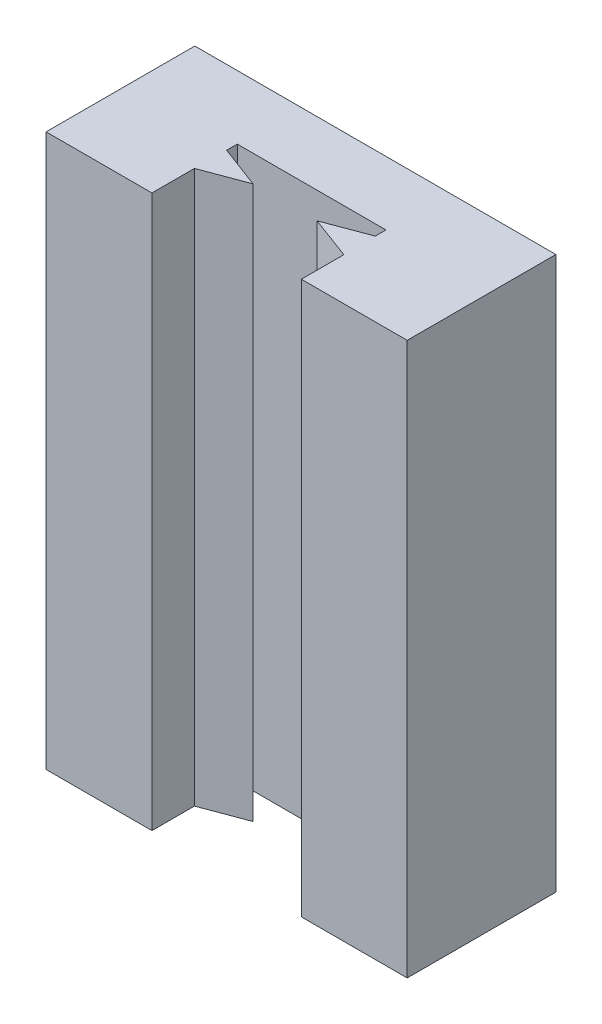
ISO-10303-21;
HEADER;
FILE_DESCRIPTION(('STEP AP214'),'2;1');
FILE_NAME('part.step','',(''),(''),'','','');
FILE_SCHEMA(('AUTOMOTIVE_DESIGN { 1 0 10303 214 1 1 1 1 }'));
ENDSEC;
DATA;
#1=APPLICATION_CONTEXT('core data for automotive mechanical design processes');
#2=APPLICATION_PROTOCOL_DEFINITION('international standard','automotive_design',2000,#1);
#3=PRODUCT_CONTEXT('',#1,'mechanical');
#4=PRODUCT('Part','Part','',(#3));
#5=PRODUCT_RELATED_PRODUCT_CATEGORY('part','',(#4));
#6=PRODUCT_DEFINITION_FORMATION('','',#4);
#7=PRODUCT_DEFINITION_CONTEXT('part definition',#1,'design');
#8=PRODUCT_DEFINITION('design','',#6,#7);
#9=PRODUCT_DEFINITION_SHAPE('','',#8);
#10=(LENGTH_UNIT() NAMED_UNIT(*) SI_UNIT(.MILLI.,.METRE.));
#11=(NAMED_UNIT(*) PLANE_ANGLE_UNIT() SI_UNIT($,.RADIAN.));
#12=(NAMED_UNIT(*) SI_UNIT($,.STERADIAN.) SOLID_ANGLE_UNIT());
#13=UNCERTAINTY_MEASURE_WITH_UNIT(LENGTH_MEASURE(1.E-05),#10,'distance_accuracy_value','');
#14=(GEOMETRIC_REPRESENTATION_CONTEXT(3) GLOBAL_UNCERTAINTY_ASSIGNED_CONTEXT((#13)) GLOBAL_UNIT_ASSIGNED_CONTEXT((#10,
#11,#12)) REPRESENTATION_CONTEXT('',''));
#15=CARTESIAN_POINT('',(0.,0.,0.));
#16=DIRECTION('',(0.,0.,1.));
#17=DIRECTION('',(1.,0.,0.));
#18=AXIS2_PLACEMENT_3D('',#15,#16,#17);
#19=CARTESIAN_POINT('',(-8.49999999999999,26.,0.));
#20=DIRECTION('',(1.,0.,0.));
#21=DIRECTION('',(0.,0.,-1.));
#22=AXIS2_PLACEMENT_3D('',#19,#20,#21);
#23=PLANE('',#22);
#24=DIRECTION('',(0.,0.,1.));
#25=VECTOR('',#24,1.);
#26=CARTESIAN_POINT('',(-8.49999999999999,0.,0.));
#27=LINE('',#26,#25);
#28=CARTESIAN_POINT('',(-8.49999999999999,0.,0.));
#29=VERTEX_POINT('',#28);
#30=CARTESIAN_POINT('',(-8.49999999999999,0.,7.));
#31=VERTEX_POINT('',#30);
#32=EDGE_CURVE('E169',#29,#31,#27,.T.);
#33=ORIENTED_EDGE('',*,*,#32,.T.);
#34=DIRECTION('',(0.,-1.,0.));
#35=VECTOR('',#34,1.);
#36=CARTESIAN_POINT('',(-8.49999999999999,26.,7.));
#37=LINE('',#36,#35);
#38=CARTESIAN_POINT('',(-8.49999999999999,26.,7.));
#39=VERTEX_POINT('',#38);
#40=EDGE_CURVE('E11',#39,#31,#37,.T.);
#41=ORIENTED_EDGE('',*,*,#40,.F.);
#42=DIRECTION('',(0.,0.,1.));
#43=VECTOR('',#42,1.);
#44=CARTESIAN_POINT('',(-8.49999999999999,26.,0.));
#45=LINE('',#44,#43);
#46=CARTESIAN_POINT('',(-8.49999999999999,26.,0.));
#47=VERTEX_POINT('',#46);
#48=EDGE_CURVE('E196',#47,#39,#45,.T.);
#49=ORIENTED_EDGE('',*,*,#48,.F.);
#50=DIRECTION('',(0.,-1.,0.));
#51=VECTOR('',#50,1.);
#52=CARTESIAN_POINT('',(-8.49999999999999,26.,0.));
#53=LINE('',#52,#51);
#54=EDGE_CURVE('E165',#47,#29,#53,.T.);
#55=ORIENTED_EDGE('',*,*,#54,.T.);
#56=EDGE_LOOP('',(#33,#41,#49,#55));
#57=FACE_BOUND('',#56,.T.);
#58=ADVANCED_FACE('F37',(#57),#23,.F.);
#59=CARTESIAN_POINT('',(-8.49999999999999,26.,7.));
#60=DIRECTION('',(0.,0.,-1.));
#61=DIRECTION('',(-1.,0.,0.));
#62=AXIS2_PLACEMENT_3D('',#59,#60,#61);
#63=PLANE('',#62);
#64=DIRECTION('',(1.,0.,0.));
#65=VECTOR('',#64,1.);
#66=CARTESIAN_POINT('',(-8.49999999999999,0.,7.));
#67=LINE('',#66,#65);
#68=CARTESIAN_POINT('',(-3.5175531470791,0.,7.));
#69=VERTEX_POINT('',#68);
#70=EDGE_CURVE('E172',#31,#69,#67,.T.);
#71=ORIENTED_EDGE('',*,*,#70,.T.);
#72=DIRECTION('',(0.,-1.,0.));
#73=VECTOR('',#72,1.);
#74=CARTESIAN_POINT('',(-3.5175531470791,26.,7.));
#75=LINE('',#74,#73);
#76=CARTESIAN_POINT('',(-3.5175531470791,26.,7.));
#77=VERTEX_POINT('',#76);
#78=EDGE_CURVE('E45',#77,#69,#75,.T.);
#79=ORIENTED_EDGE('',*,*,#78,.F.);
#80=DIRECTION('',(1.,0.,0.));
#81=VECTOR('',#80,1.);
#82=CARTESIAN_POINT('',(-8.49999999999999,26.,7.));
#83=LINE('',#82,#81);
#84=EDGE_CURVE('E114',#39,#77,#83,.T.);
#85=ORIENTED_EDGE('',*,*,#84,.F.);
#86=ORIENTED_EDGE('',*,*,#40,.T.);
#87=EDGE_LOOP('',(#71,#79,#85,#86));
#88=FACE_BOUND('',#87,.T.);
#89=ADVANCED_FACE('F287',(#88),#63,.F.);
#90=CARTESIAN_POINT('',(-3.5175531470791,26.,7.));
#91=DIRECTION('',(-1.,0.,0.));
#92=DIRECTION('',(0.,0.,1.));
#93=AXIS2_PLACEMENT_3D('',#90,#91,#92);
#94=PLANE('',#93);
#95=DIRECTION('',(0.,0.,-1.));
#96=VECTOR('',#95,1.);
#97=CARTESIAN_POINT('',(-3.5175531470791,0.,7.));
#98=LINE('',#97,#96);
#99=CARTESIAN_POINT('',(-3.5175531470791,0.,5.));
#100=VERTEX_POINT('',#99);
#101=EDGE_CURVE('E175',#69,#100,#98,.T.);
#102=ORIENTED_EDGE('',*,*,#101,.T.);
#103=DIRECTION('',(0.,-1.,0.));
#104=VECTOR('',#103,1.);
#105=CARTESIAN_POINT('',(-3.5175531470791,26.,5.));
#106=LINE('',#105,#104);
#107=CARTESIAN_POINT('',(-3.5175531470791,26.,5.));
#108=VERTEX_POINT('',#107);
#109=EDGE_CURVE('E221',#108,#100,#106,.T.);
#110=ORIENTED_EDGE('',*,*,#109,.F.);
#111=DIRECTION('',(0.,0.,-1.));
#112=VECTOR('',#111,1.);
#113=CARTESIAN_POINT('',(-3.5175531470791,26.,7.));
#114=LINE('',#113,#112);
#115=EDGE_CURVE('E229',#77,#108,#114,.T.);
#116=ORIENTED_EDGE('',*,*,#115,.F.);
#117=ORIENTED_EDGE('',*,*,#78,.T.);
#118=EDGE_LOOP('',(#102,#110,#116,#117));
#119=FACE_BOUND('',#118,.T.);
#120=ADVANCED_FACE('F227',(#119),#94,.F.);
#121=CARTESIAN_POINT('',(-3.5175531470791,26.,5.));
#122=DIRECTION('',(-0.349756467250429,0.,-0.936840655403308));
#123=DIRECTION('',(-0.936840655403308,0.,0.349756467250429));
#124=AXIS2_PLACEMENT_3D('',#121,#122,#123);
#125=PLANE('',#124);
#126=DIRECTION('',(0.936840655403308,0.,-0.349756467250429));
#127=VECTOR('',#126,1.);
#128=CARTESIAN_POINT('',(-3.5175531470791,0.,5.));
#129=LINE('',#128,#127);
#130=CARTESIAN_POINT('',(-1.50863963912847,0.,4.25));
#131=VERTEX_POINT('',#130);
#132=EDGE_CURVE('E177',#100,#131,#129,.T.);
#133=ORIENTED_EDGE('',*,*,#132,.T.);
#134=DIRECTION('',(0.,-1.,0.));
#135=VECTOR('',#134,1.);
#136=CARTESIAN_POINT('',(-1.50863963912847,26.,4.25));
#137=LINE('',#136,#135);
#138=CARTESIAN_POINT('',(-1.50863963912847,26.,4.25));
#139=VERTEX_POINT('',#138);
#140=EDGE_CURVE('E218',#139,#131,#137,.T.);
#141=ORIENTED_EDGE('',*,*,#140,.F.);
#142=DIRECTION('',(0.936840655403308,0.,-0.349756467250429));
#143=VECTOR('',#142,1.);
#144=CARTESIAN_POINT('',(-3.5175531470791,26.,5.));
#145=LINE('',#144,#143);
#146=EDGE_CURVE('E247',#108,#139,#145,.T.);
#147=ORIENTED_EDGE('',*,*,#146,.F.);
#148=ORIENTED_EDGE('',*,*,#109,.T.);
#149=EDGE_LOOP('',(#133,#141,#147,#148));
#150=FACE_BOUND('',#149,.T.);
#151=ADVANCED_FACE('F238',(#150),#125,.F.);
#152=CARTESIAN_POINT('',(-1.50863963912847,26.,4.25));
#153=DIRECTION('',(-0.352457927214223,0.,0.935827660172456));
#154=DIRECTION('',(0.935827660172456,0.,0.352457927214223));
#155=AXIS2_PLACEMENT_3D('',#152,#153,#154);
#156=PLANE('',#155);
#157=DIRECTION('',(-0.935827660172456,0.,-0.352457927214223));
#158=VECTOR('',#157,1.);
#159=CARTESIAN_POINT('',(-1.50863963912847,0.,4.25));
#160=LINE('',#159,#158);
#161=CARTESIAN_POINT('',(-3.49999999999999,0.,3.5));
#162=VERTEX_POINT('',#161);
#163=EDGE_CURVE('E179',#131,#162,#160,.T.);
#164=ORIENTED_EDGE('',*,*,#163,.T.);
#165=DIRECTION('',(0.,-1.,0.));
#166=VECTOR('',#165,1.);
#167=CARTESIAN_POINT('',(-3.49999999999999,26.,3.5));
#168=LINE('',#167,#166);
#169=CARTESIAN_POINT('',(-3.49999999999999,26.,3.5));
#170=VERTEX_POINT('',#169);
#171=EDGE_CURVE('E215',#170,#162,#168,.T.);
#172=ORIENTED_EDGE('',*,*,#171,.F.);
#173=DIRECTION('',(-0.935827660172456,0.,-0.352457927214223));
#174=VECTOR('',#173,1.);
#175=CARTESIAN_POINT('',(-1.50863963912847,26.,4.25));
#176=LINE('',#175,#174);
#177=EDGE_CURVE('E244',#139,#170,#176,.T.);
#178=ORIENTED_EDGE('',*,*,#177,.F.);
#179=ORIENTED_EDGE('',*,*,#140,.T.);
#180=EDGE_LOOP('',(#164,#172,#178,#179));
#181=FACE_BOUND('',#180,.T.);
#182=ADVANCED_FACE('F242',(#181),#156,.F.);
#183=CARTESIAN_POINT('',(-3.49999999999999,26.,3.5));
#184=DIRECTION('',(-1.,0.,0.));
#185=DIRECTION('',(0.,0.,1.));
#186=AXIS2_PLACEMENT_3D('',#183,#184,#185);
#187=PLANE('',#186);
#188=DIRECTION('',(0.,0.,-1.));
#189=VECTOR('',#188,1.);
#190=CARTESIAN_POINT('',(-3.49999999999999,0.,3.5));
#191=LINE('',#190,#189);
#192=CARTESIAN_POINT('',(-3.49999999999999,0.,3.));
#193=VERTEX_POINT('',#192);
#194=EDGE_CURVE('E181',#162,#193,#191,.T.);
#195=ORIENTED_EDGE('',*,*,#194,.T.);
#196=DIRECTION('',(0.,-1.,0.));
#197=VECTOR('',#196,1.);
#198=CARTESIAN_POINT('',(-3.49999999999999,26.,3.));
#199=LINE('',#198,#197);
#200=CARTESIAN_POINT('',(-3.49999999999999,26.,3.));
#201=VERTEX_POINT('',#200);
#202=EDGE_CURVE('E212',#201,#193,#199,.T.);
#203=ORIENTED_EDGE('',*,*,#202,.F.);
#204=DIRECTION('',(0.,0.,-1.));
#205=VECTOR('',#204,1.);
#206=CARTESIAN_POINT('',(-3.49999999999999,26.,3.5));
#207=LINE('',#206,#205);
#208=EDGE_CURVE('E246',#170,#201,#207,.T.);
#209=ORIENTED_EDGE('',*,*,#208,.F.);
#210=ORIENTED_EDGE('',*,*,#171,.T.);
#211=EDGE_LOOP('',(#195,#203,#209,#210));
#212=FACE_BOUND('',#211,.T.);
#213=ADVANCED_FACE('F300',(#212),#187,.F.);
#214=CARTESIAN_POINT('',(-3.49999999999999,26.,3.));
#215=DIRECTION('',(0.,0.,-1.));
#216=DIRECTION('',(-1.,0.,0.));
#217=AXIS2_PLACEMENT_3D('',#214,#215,#216);
#218=PLANE('',#217);
#219=DIRECTION('',(1.,0.,0.));
#220=VECTOR('',#219,1.);
#221=CARTESIAN_POINT('',(-3.49999999999999,0.,3.));
#222=LINE('',#221,#220);
#223=CARTESIAN_POINT('',(3.50000000000001,0.,3.));
#224=VERTEX_POINT('',#223);
#225=EDGE_CURVE('E183',#193,#224,#222,.T.);
#226=ORIENTED_EDGE('',*,*,#225,.T.);
#227=DIRECTION('',(0.,-1.,0.));
#228=VECTOR('',#227,1.);
#229=CARTESIAN_POINT('',(3.50000000000001,26.,3.));
#230=LINE('',#229,#228);
#231=CARTESIAN_POINT('',(3.50000000000001,26.,3.));
#232=VERTEX_POINT('',#231);
#233=EDGE_CURVE('E209',#232,#224,#230,.T.);
#234=ORIENTED_EDGE('',*,*,#233,.F.);
#235=DIRECTION('',(1.,0.,0.));
#236=VECTOR('',#235,1.);
#237=CARTESIAN_POINT('',(-3.49999999999999,26.,3.));
#238=LINE('',#237,#236);
#239=EDGE_CURVE('E249',#201,#232,#238,.T.);
#240=ORIENTED_EDGE('',*,*,#239,.F.);
#241=ORIENTED_EDGE('',*,*,#202,.T.);
#242=EDGE_LOOP('',(#226,#234,#240,#241));
#243=FACE_BOUND('',#242,.T.);
#244=ADVANCED_FACE('F303',(#243),#218,.F.);
#245=CARTESIAN_POINT('',(3.50000000000001,26.,3.5));
#246=DIRECTION('',(1.,0.,0.));
#247=DIRECTION('',(0.,0.,-1.));
#248=AXIS2_PLACEMENT_3D('',#245,#246,#247);
#249=PLANE('',#248);
#250=DIRECTION('',(0.,0.,1.));
#251=VECTOR('',#250,1.);
#252=CARTESIAN_POINT('',(3.50000000000001,0.,3.5));
#253=LINE('',#252,#251);
#254=CARTESIAN_POINT('',(3.50000000000001,0.,3.5));
#255=VERTEX_POINT('',#254);
#256=EDGE_CURVE('E185',#224,#255,#253,.T.);
#257=ORIENTED_EDGE('',*,*,#256,.T.);
#258=DIRECTION('',(0.,-1.,0.));
#259=VECTOR('',#258,1.);
#260=CARTESIAN_POINT('',(3.50000000000001,26.,3.5));
#261=LINE('',#260,#259);
#262=CARTESIAN_POINT('',(3.50000000000001,26.,3.5));
#263=VERTEX_POINT('',#262);
#264=EDGE_CURVE('E206',#263,#255,#261,.T.);
#265=ORIENTED_EDGE('',*,*,#264,.F.);
#266=DIRECTION('',(0.,0.,1.));
#267=VECTOR('',#266,1.);
#268=CARTESIAN_POINT('',(3.50000000000001,26.,3.5));
#269=LINE('',#268,#267);
#270=EDGE_CURVE('E255',#232,#263,#269,.T.);
#271=ORIENTED_EDGE('',*,*,#270,.F.);
#272=ORIENTED_EDGE('',*,*,#233,.T.);
#273=EDGE_LOOP('',(#257,#265,#271,#272));
#274=FACE_BOUND('',#273,.T.);
#275=ADVANCED_FACE('F307',(#274),#249,.F.);
#276=CARTESIAN_POINT('',(1.50863963912849,26.,4.25));
#277=DIRECTION('',(0.352457927214223,0.,0.935827660172456));
#278=DIRECTION('',(0.935827660172456,0.,-0.352457927214223));
#279=AXIS2_PLACEMENT_3D('',#276,#277,#278);
#280=PLANE('',#279);
#281=DIRECTION('',(-0.935827660172456,0.,0.352457927214223));
#282=VECTOR('',#281,1.);
#283=CARTESIAN_POINT('',(1.50863963912849,0.,4.25));
#284=LINE('',#283,#282);
#285=CARTESIAN_POINT('',(1.50863963912849,0.,4.25));
#286=VERTEX_POINT('',#285);
#287=EDGE_CURVE('E187',#255,#286,#284,.T.);
#288=ORIENTED_EDGE('',*,*,#287,.T.);
#289=DIRECTION('',(0.,-1.,0.));
#290=VECTOR('',#289,1.);
#291=CARTESIAN_POINT('',(1.50863963912849,26.,4.25));
#292=LINE('',#291,#290);
#293=CARTESIAN_POINT('',(1.50863963912849,26.,4.25));
#294=VERTEX_POINT('',#293);
#295=EDGE_CURVE('E203',#294,#286,#292,.T.);
#296=ORIENTED_EDGE('',*,*,#295,.F.);
#297=DIRECTION('',(-0.935827660172456,0.,0.352457927214223));
#298=VECTOR('',#297,1.);
#299=CARTESIAN_POINT('',(1.50863963912849,26.,4.25));
#300=LINE('',#299,#298);
#301=EDGE_CURVE('E257',#263,#294,#300,.T.);
#302=ORIENTED_EDGE('',*,*,#301,.F.);
#303=ORIENTED_EDGE('',*,*,#264,.T.);
#304=EDGE_LOOP('',(#288,#296,#302,#303));
#305=FACE_BOUND('',#304,.T.);
#306=ADVANCED_FACE('F311',(#305),#280,.F.);
#307=CARTESIAN_POINT('',(3.51755314707913,26.,5.));
#308=DIRECTION('',(0.349756467250428,0.,-0.936840655403308));
#309=DIRECTION('',(-0.936840655403308,0.,-0.349756467250428));
#310=AXIS2_PLACEMENT_3D('',#307,#308,#309);
#311=PLANE('',#310);
#312=DIRECTION('',(0.936840655403308,0.,0.349756467250428));
#313=VECTOR('',#312,1.);
#314=CARTESIAN_POINT('',(3.51755314707913,0.,5.));
#315=LINE('',#314,#313);
#316=CARTESIAN_POINT('',(3.51755314707913,0.,5.));
#317=VERTEX_POINT('',#316);
#318=EDGE_CURVE('E189',#286,#317,#315,.T.);
#319=ORIENTED_EDGE('',*,*,#318,.T.);
#320=DIRECTION('',(0.,-1.,0.));
#321=VECTOR('',#320,1.);
#322=CARTESIAN_POINT('',(3.51755314707913,26.,5.));
#323=LINE('',#322,#321);
#324=CARTESIAN_POINT('',(3.51755314707913,26.,5.));
#325=VERTEX_POINT('',#324);
#326=EDGE_CURVE('E200',#325,#317,#323,.T.);
#327=ORIENTED_EDGE('',*,*,#326,.F.);
#328=DIRECTION('',(0.936840655403308,0.,0.349756467250428));
#329=VECTOR('',#328,1.);
#330=CARTESIAN_POINT('',(3.51755314707913,26.,5.));
#331=LINE('',#330,#329);
#332=EDGE_CURVE('E259',#294,#325,#331,.T.);
#333=ORIENTED_EDGE('',*,*,#332,.F.);
#334=ORIENTED_EDGE('',*,*,#295,.T.);
#335=EDGE_LOOP('',(#319,#327,#333,#334));
#336=FACE_BOUND('',#335,.T.);
#337=ADVANCED_FACE('F265',(#336),#311,.F.);
#338=CARTESIAN_POINT('',(3.51755314707913,26.,7.));
#339=DIRECTION('',(1.,0.,0.));
#340=DIRECTION('',(0.,0.,-1.));
#341=AXIS2_PLACEMENT_3D('',#338,#339,#340);
#342=PLANE('',#341);
#343=DIRECTION('',(0.,0.,1.));
#344=VECTOR('',#343,1.);
#345=CARTESIAN_POINT('',(3.51755314707913,0.,7.));
#346=LINE('',#345,#344);
#347=CARTESIAN_POINT('',(3.51755314707913,0.,7.));
#348=VERTEX_POINT('',#347);
#349=EDGE_CURVE('E191',#317,#348,#346,.T.);
#350=ORIENTED_EDGE('',*,*,#349,.T.);
#351=DIRECTION('',(0.,-1.,0.));
#352=VECTOR('',#351,1.);
#353=CARTESIAN_POINT('',(3.51755314707913,26.,7.));
#354=LINE('',#353,#352);
#355=CARTESIAN_POINT('',(3.51755314707913,26.,7.));
#356=VERTEX_POINT('',#355);
#357=EDGE_CURVE('E160',#356,#348,#354,.T.);
#358=ORIENTED_EDGE('',*,*,#357,.F.);
#359=DIRECTION('',(0.,0.,1.));
#360=VECTOR('',#359,1.);
#361=CARTESIAN_POINT('',(3.51755314707913,26.,7.));
#362=LINE('',#361,#360);
#363=EDGE_CURVE('E151',#325,#356,#362,.T.);
#364=ORIENTED_EDGE('',*,*,#363,.F.);
#365=ORIENTED_EDGE('',*,*,#326,.T.);
#366=EDGE_LOOP('',(#350,#358,#364,#365));
#367=FACE_BOUND('',#366,.T.);
#368=ADVANCED_FACE('F269',(#367),#342,.F.);
#369=CARTESIAN_POINT('',(8.50000000000002,26.,7.));
#370=DIRECTION('',(0.,0.,-1.));
#371=DIRECTION('',(-1.,0.,0.));
#372=AXIS2_PLACEMENT_3D('',#369,#370,#371);
#373=PLANE('',#372);
#374=DIRECTION('',(1.,0.,0.));
#375=VECTOR('',#374,1.);
#376=CARTESIAN_POINT('',(8.50000000000002,0.,7.));
#377=LINE('',#376,#375);
#378=CARTESIAN_POINT('',(8.50000000000002,0.,7.));
#379=VERTEX_POINT('',#378);
#380=EDGE_CURVE('E159',#348,#379,#377,.T.);
#381=ORIENTED_EDGE('',*,*,#380,.T.);
#382=DIRECTION('',(0.,-1.,0.));
#383=VECTOR('',#382,1.);
#384=CARTESIAN_POINT('',(8.50000000000002,26.,7.));
#385=LINE('',#384,#383);
#386=CARTESIAN_POINT('',(8.50000000000002,26.,7.));
#387=VERTEX_POINT('',#386);
#388=EDGE_CURVE('E156',#387,#379,#385,.T.);
#389=ORIENTED_EDGE('',*,*,#388,.F.);
#390=DIRECTION('',(1.,0.,0.));
#391=VECTOR('',#390,1.);
#392=CARTESIAN_POINT('',(8.50000000000002,26.,7.));
#393=LINE('',#392,#391);
#394=EDGE_CURVE('E145',#356,#387,#393,.T.);
#395=ORIENTED_EDGE('',*,*,#394,.F.);
#396=ORIENTED_EDGE('',*,*,#357,.T.);
#397=EDGE_LOOP('',(#381,#389,#395,#396));
#398=FACE_BOUND('',#397,.T.);
#399=ADVANCED_FACE('F157',(#398),#373,.F.);
#400=CARTESIAN_POINT('',(8.50000000000001,26.,0.));
#401=DIRECTION('',(-1.,0.,0.));
#402=DIRECTION('',(0.,0.,1.));
#403=AXIS2_PLACEMENT_3D('',#400,#401,#402);
#404=PLANE('',#403);
#405=DIRECTION('',(0.,0.,-1.));
#406=VECTOR('',#405,1.);
#407=CARTESIAN_POINT('',(8.50000000000001,0.,0.));
#408=LINE('',#407,#406);
#409=CARTESIAN_POINT('',(8.50000000000001,0.,0.));
#410=VERTEX_POINT('',#409);
#411=EDGE_CURVE('E100',#379,#410,#408,.T.);
#412=ORIENTED_EDGE('',*,*,#411,.T.);
#413=DIRECTION('',(0.,-1.,0.));
#414=VECTOR('',#413,1.);
#415=CARTESIAN_POINT('',(8.50000000000001,26.,0.));
#416=LINE('',#415,#414);
#417=CARTESIAN_POINT('',(8.50000000000001,26.,0.));
#418=VERTEX_POINT('',#417);
#419=EDGE_CURVE('E161',#418,#410,#416,.T.);
#420=ORIENTED_EDGE('',*,*,#419,.F.);
#421=DIRECTION('',(0.,0.,-1.));
#422=VECTOR('',#421,1.);
#423=CARTESIAN_POINT('',(8.50000000000001,26.,0.));
#424=LINE('',#423,#422);
#425=EDGE_CURVE('E149',#387,#418,#424,.T.);
#426=ORIENTED_EDGE('',*,*,#425,.F.);
#427=ORIENTED_EDGE('',*,*,#388,.T.);
#428=EDGE_LOOP('',(#412,#420,#426,#427));
#429=FACE_BOUND('',#428,.T.);
#430=ADVANCED_FACE('F163',(#429),#404,.F.);
#431=CARTESIAN_POINT('',(-8.49999999999999,26.,0.));
#432=DIRECTION('',(0.,0.,1.));
#433=DIRECTION('',(1.,0.,0.));
#434=AXIS2_PLACEMENT_3D('',#431,#432,#433);
#435=PLANE('',#434);
#436=CARTESIAN_POINT('',(5.99999999999999,19.5,0.));
#437=DIRECTION('',(0.,0.,-1.));
#438=DIRECTION('',(1.,0.,0.));
#439=AXIS2_PLACEMENT_3D('',#436,#437,#438);
#440=CIRCLE('',#439,1.);
#441=CARTESIAN_POINT('',(6.99999999999999,19.5,0.));
#442=VERTEX_POINT('',#441);
#443=EDGE_CURVE('E439',#442,#442,#440,.T.);
#444=ORIENTED_EDGE('',*,*,#443,.F.);
#445=EDGE_LOOP('',(#444));
#446=FACE_BOUND('',#445,.T.);
#447=CARTESIAN_POINT('',(5.99999999999999,6.5,0.));
#448=DIRECTION('',(0.,0.,-1.));
#449=DIRECTION('',(1.,0.,0.));
#450=AXIS2_PLACEMENT_3D('',#447,#448,#449);
#451=CIRCLE('',#450,1.);
#452=CARTESIAN_POINT('',(6.99999999999999,6.5,0.));
#453=VERTEX_POINT('',#452);
#454=EDGE_CURVE('E438',#453,#453,#451,.T.);
#455=ORIENTED_EDGE('',*,*,#454,.F.);
#456=EDGE_LOOP('',(#455));
#457=FACE_BOUND('',#456,.T.);
#458=CARTESIAN_POINT('',(-5.99999999999999,6.5,0.));
#459=DIRECTION('',(0.,0.,-1.));
#460=DIRECTION('',(-1.,0.,0.));
#461=AXIS2_PLACEMENT_3D('',#458,#459,#460);
#462=CIRCLE('',#461,1.);
#463=CARTESIAN_POINT('',(-6.99999999999999,6.5,0.));
#464=VERTEX_POINT('',#463);
#465=EDGE_CURVE('E448',#464,#464,#462,.T.);
#466=ORIENTED_EDGE('',*,*,#465,.F.);
#467=EDGE_LOOP('',(#466));
#468=FACE_BOUND('',#467,.T.);
#469=CARTESIAN_POINT('',(-5.99999999999999,19.5,0.));
#470=DIRECTION('',(0.,0.,-1.));
#471=DIRECTION('',(-1.,0.,0.));
#472=AXIS2_PLACEMENT_3D('',#469,#470,#471);
#473=CIRCLE('',#472,1.);
#474=CARTESIAN_POINT('',(-6.99999999999999,19.5,0.));
#475=VERTEX_POINT('',#474);
#476=EDGE_CURVE('E453',#475,#475,#473,.T.);
#477=ORIENTED_EDGE('',*,*,#476,.F.);
#478=EDGE_LOOP('',(#477));
#479=FACE_BOUND('',#478,.T.);
#480=DIRECTION('',(-1.,0.,0.));
#481=VECTOR('',#480,1.);
#482=CARTESIAN_POINT('',(-8.49999999999999,0.,0.));
#483=LINE('',#482,#481);
#484=EDGE_CURVE('E106',#410,#29,#483,.T.);
#485=ORIENTED_EDGE('',*,*,#484,.T.);
#486=ORIENTED_EDGE('',*,*,#54,.F.);
#487=DIRECTION('',(-1.,0.,0.));
#488=VECTOR('',#487,1.);
#489=CARTESIAN_POINT('',(-8.49999999999999,26.,0.));
#490=LINE('',#489,#488);
#491=EDGE_CURVE('E53',#418,#47,#490,.T.);
#492=ORIENTED_EDGE('',*,*,#491,.F.);
#493=ORIENTED_EDGE('',*,*,#419,.T.);
#494=EDGE_LOOP('',(#485,#486,#492,#493));
#495=FACE_BOUND('',#494,.T.);
#496=ADVANCED_FACE('F273',(#446,#457,#468,#479,#495),#435,.F.);
#497=CARTESIAN_POINT('',(0.,26.,0.));
#498=DIRECTION('',(0.,1.,0.));
#499=DIRECTION('',(0.,0.,1.));
#500=AXIS2_PLACEMENT_3D('',#497,#498,#499);
#501=PLANE('',#500);
#502=ORIENTED_EDGE('',*,*,#48,.T.);
#503=ORIENTED_EDGE('',*,*,#84,.T.);
#504=ORIENTED_EDGE('',*,*,#115,.T.);
#505=ORIENTED_EDGE('',*,*,#146,.T.);
#506=ORIENTED_EDGE('',*,*,#177,.T.);
#507=ORIENTED_EDGE('',*,*,#208,.T.);
#508=ORIENTED_EDGE('',*,*,#239,.T.);
#509=ORIENTED_EDGE('',*,*,#270,.T.);
#510=ORIENTED_EDGE('',*,*,#301,.T.);
#511=ORIENTED_EDGE('',*,*,#332,.T.);
#512=ORIENTED_EDGE('',*,*,#363,.T.);
#513=ORIENTED_EDGE('',*,*,#394,.T.);
#514=ORIENTED_EDGE('',*,*,#425,.T.);
#515=ORIENTED_EDGE('',*,*,#491,.T.);
#516=EDGE_LOOP('',(#502,#503,#504,#505,#506,#507,#508,#509,#510,#511,#512,#513,#514,#515));
#517=FACE_BOUND('',#516,.T.);
#518=ADVANCED_FACE('F147',(#517),#501,.T.);
#519=CARTESIAN_POINT('',(0.,0.,0.));
#520=DIRECTION('',(0.,1.,0.));
#521=DIRECTION('',(0.,0.,1.));
#522=AXIS2_PLACEMENT_3D('',#519,#520,#521);
#523=PLANE('',#522);
#524=ORIENTED_EDGE('',*,*,#32,.F.);
#525=ORIENTED_EDGE('',*,*,#484,.F.);
#526=ORIENTED_EDGE('',*,*,#411,.F.);
#527=ORIENTED_EDGE('',*,*,#380,.F.);
#528=ORIENTED_EDGE('',*,*,#349,.F.);
#529=ORIENTED_EDGE('',*,*,#318,.F.);
#530=ORIENTED_EDGE('',*,*,#287,.F.);
#531=ORIENTED_EDGE('',*,*,#256,.F.);
#532=ORIENTED_EDGE('',*,*,#225,.F.);
#533=ORIENTED_EDGE('',*,*,#194,.F.);
#534=ORIENTED_EDGE('',*,*,#163,.F.);
#535=ORIENTED_EDGE('',*,*,#132,.F.);
#536=ORIENTED_EDGE('',*,*,#101,.F.);
#537=ORIENTED_EDGE('',*,*,#70,.F.);
#538=EDGE_LOOP('',(#524,#525,#526,#527,#528,#529,#530,#531,#532,#533,#534,#535,#536,#537));
#539=FACE_BOUND('',#538,.T.);
#540=ADVANCED_FACE('F233',(#539),#523,.F.);
#541=CARTESIAN_POINT('',(-5.99999999999999,19.5,3.));
#542=DIRECTION('',(0.,0.,-1.));
#543=DIRECTION('',(-1.,0.,0.));
#544=AXIS2_PLACEMENT_3D('',#541,#542,#543);
#545=CYLINDRICAL_SURFACE('',#544,1.);
#546=CARTESIAN_POINT('',(-5.99999999999999,19.5,3.));
#547=DIRECTION('',(0.,0.,-1.));
#548=DIRECTION('',(-1.,0.,0.));
#549=AXIS2_PLACEMENT_3D('',#546,#547,#548);
#550=CIRCLE('',#549,1.);
#551=CARTESIAN_POINT('',(-6.99999999999999,19.5,3.));
#552=VERTEX_POINT('',#551);
#553=EDGE_CURVE('E173',#552,#552,#550,.T.);
#554=ORIENTED_EDGE('',*,*,#553,.F.);
#555=EDGE_LOOP('',(#554));
#556=FACE_BOUND('',#555,.T.);
#557=ORIENTED_EDGE('',*,*,#476,.T.);
#558=EDGE_LOOP('',(#557));
#559=FACE_BOUND('',#558,.T.);
#560=ADVANCED_FACE('F344',(#556,#559),#545,.F.);
#561=CARTESIAN_POINT('',(-5.99999999999999,19.5,3.));
#562=DIRECTION('',(0.,0.,-1.));
#563=DIRECTION('',(-1.,0.,0.));
#564=AXIS2_PLACEMENT_3D('',#561,#562,#563);
#565=PLANE('',#564);
#566=ORIENTED_EDGE('',*,*,#553,.T.);
#567=EDGE_LOOP('',(#566));
#568=FACE_BOUND('',#567,.T.);
#569=ADVANCED_FACE('F357',(#568),#565,.T.);
#570=CARTESIAN_POINT('',(-5.99999999999999,6.5,3.));
#571=DIRECTION('',(0.,0.,-1.));
#572=DIRECTION('',(-1.,0.,0.));
#573=AXIS2_PLACEMENT_3D('',#570,#571,#572);
#574=CYLINDRICAL_SURFACE('',#573,1.);
#575=CARTESIAN_POINT('',(-5.99999999999999,6.5,3.));
#576=DIRECTION('',(0.,0.,-1.));
#577=DIRECTION('',(-1.,0.,0.));
#578=AXIS2_PLACEMENT_3D('',#575,#576,#577);
#579=CIRCLE('',#578,1.);
#580=CARTESIAN_POINT('',(-6.99999999999999,6.5,3.));
#581=VERTEX_POINT('',#580);
#582=EDGE_CURVE('E450',#581,#581,#579,.T.);
#583=ORIENTED_EDGE('',*,*,#582,.F.);
#584=EDGE_LOOP('',(#583));
#585=FACE_BOUND('',#584,.T.);
#586=ORIENTED_EDGE('',*,*,#465,.T.);
#587=EDGE_LOOP('',(#586));
#588=FACE_BOUND('',#587,.T.);
#589=ADVANCED_FACE('F368',(#585,#588),#574,.F.);
#590=CARTESIAN_POINT('',(-5.99999999999999,6.5,3.));
#591=DIRECTION('',(0.,0.,-1.));
#592=DIRECTION('',(-1.,0.,0.));
#593=AXIS2_PLACEMENT_3D('',#590,#591,#592);
#594=PLANE('',#593);
#595=ORIENTED_EDGE('',*,*,#582,.T.);
#596=EDGE_LOOP('',(#595));
#597=FACE_BOUND('',#596,.T.);
#598=ADVANCED_FACE('F378',(#597),#594,.T.);
#599=CARTESIAN_POINT('',(5.99999999999999,6.5,3.));
#600=DIRECTION('',(0.,0.,-1.));
#601=DIRECTION('',(-1.,0.,0.));
#602=AXIS2_PLACEMENT_3D('',#599,#600,#601);
#603=CYLINDRICAL_SURFACE('',#602,1.);
#604=CARTESIAN_POINT('',(5.99999999999999,6.5,3.));
#605=DIRECTION('',(0.,0.,-1.));
#606=DIRECTION('',(1.,0.,0.));
#607=AXIS2_PLACEMENT_3D('',#604,#605,#606);
#608=CIRCLE('',#607,1.);
#609=CARTESIAN_POINT('',(6.99999999999999,6.5,3.));
#610=VERTEX_POINT('',#609);
#611=EDGE_CURVE('E442',#610,#610,#608,.T.);
#612=ORIENTED_EDGE('',*,*,#611,.F.);
#613=EDGE_LOOP('',(#612));
#614=FACE_BOUND('',#613,.T.);
#615=ORIENTED_EDGE('',*,*,#454,.T.);
#616=EDGE_LOOP('',(#615));
#617=FACE_BOUND('',#616,.T.);
#618=ADVANCED_FACE('F389',(#614,#617),#603,.F.);
#619=CARTESIAN_POINT('',(5.99999999999999,6.5,3.));
#620=DIRECTION('',(0.,0.,1.));
#621=DIRECTION('',(1.,0.,0.));
#622=AXIS2_PLACEMENT_3D('',#619,#620,#621);
#623=PLANE('',#622);
#624=ORIENTED_EDGE('',*,*,#611,.T.);
#625=EDGE_LOOP('',(#624));
#626=FACE_BOUND('',#625,.T.);
#627=ADVANCED_FACE('F399',(#626),#623,.F.);
#628=CARTESIAN_POINT('',(5.99999999999999,19.5,3.));
#629=DIRECTION('',(0.,0.,-1.));
#630=DIRECTION('',(-1.,0.,0.));
#631=AXIS2_PLACEMENT_3D('',#628,#629,#630);
#632=CYLINDRICAL_SURFACE('',#631,1.);
#633=CARTESIAN_POINT('',(5.99999999999999,19.5,3.));
#634=DIRECTION('',(0.,0.,-1.));
#635=DIRECTION('',(1.,0.,0.));
#636=AXIS2_PLACEMENT_3D('',#633,#634,#635);
#637=CIRCLE('',#636,1.);
#638=CARTESIAN_POINT('',(6.99999999999999,19.5,3.));
#639=VERTEX_POINT('',#638);
#640=EDGE_CURVE('E437',#639,#639,#637,.T.);
#641=ORIENTED_EDGE('',*,*,#640,.F.);
#642=EDGE_LOOP('',(#641));
#643=FACE_BOUND('',#642,.T.);
#644=ORIENTED_EDGE('',*,*,#443,.T.);
#645=EDGE_LOOP('',(#644));
#646=FACE_BOUND('',#645,.T.);
#647=ADVANCED_FACE('F410',(#643,#646),#632,.F.);
#648=CARTESIAN_POINT('',(5.99999999999999,19.5,3.));
#649=DIRECTION('',(0.,0.,1.));
#650=DIRECTION('',(1.,0.,0.));
#651=AXIS2_PLACEMENT_3D('',#648,#649,#650);
#652=PLANE('',#651);
#653=ORIENTED_EDGE('',*,*,#640,.T.);
#654=EDGE_LOOP('',(#653));
#655=FACE_BOUND('',#654,.T.);
#656=ADVANCED_FACE('F420',(#655),#652,.F.);
#657=CLOSED_SHELL('',(#58,#89,#120,#151,#182,#213,#244,#275,#306,#337,#368,#399,#430,#496,#518,
#540,#560,#569,#589,#598,#618,#627,#647,#656));
#658=MANIFOLD_SOLID_BREP('B2',#657);
#659=ADVANCED_BREP_SHAPE_REPRESENTATION('',(#18,#658),#14);
#660=SHAPE_DEFINITION_REPRESENTATION(#9,#659);
ENDSEC;
END-ISO-10303-21;
